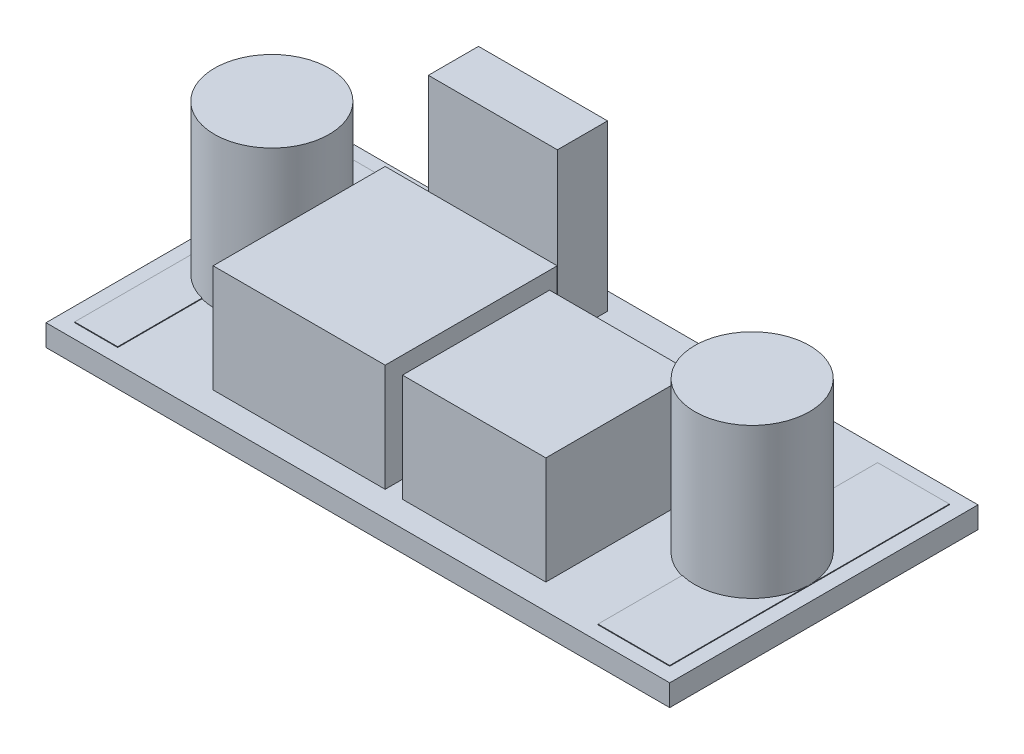
ISO-10303-21;
HEADER;
FILE_DESCRIPTION(('STEP AP214'),'2;1');
FILE_NAME('part.step','',(''),(''),'','','');
FILE_SCHEMA(('AUTOMOTIVE_DESIGN { 1 0 10303 214 1 1 1 1 }'));
ENDSEC;
DATA;
#1=APPLICATION_CONTEXT('core data for automotive mechanical design processes');
#2=APPLICATION_PROTOCOL_DEFINITION('international standard','automotive_design',2000,#1);
#3=PRODUCT_CONTEXT('',#1,'mechanical');
#4=PRODUCT('Part','Part','',(#3));
#5=PRODUCT_RELATED_PRODUCT_CATEGORY('part','',(#4));
#6=PRODUCT_DEFINITION_FORMATION('','',#4);
#7=PRODUCT_DEFINITION_CONTEXT('part definition',#1,'design');
#8=PRODUCT_DEFINITION('design','',#6,#7);
#9=PRODUCT_DEFINITION_SHAPE('','',#8);
#10=(LENGTH_UNIT() NAMED_UNIT(*) SI_UNIT(.MILLI.,.METRE.));
#11=(NAMED_UNIT(*) PLANE_ANGLE_UNIT() SI_UNIT($,.RADIAN.));
#12=(NAMED_UNIT(*) SI_UNIT($,.STERADIAN.) SOLID_ANGLE_UNIT());
#13=UNCERTAINTY_MEASURE_WITH_UNIT(LENGTH_MEASURE(1.E-05),#10,'distance_accuracy_value','');
#14=(GEOMETRIC_REPRESENTATION_CONTEXT(3) GLOBAL_UNCERTAINTY_ASSIGNED_CONTEXT((#13)) GLOBAL_UNIT_ASSIGNED_CONTEXT((#10,
#11,#12)) REPRESENTATION_CONTEXT('',''));
#15=CARTESIAN_POINT('',(0.,0.,0.));
#16=DIRECTION('',(0.,0.,1.));
#17=DIRECTION('',(1.,0.,0.));
#18=AXIS2_PLACEMENT_3D('',#15,#16,#17);
#19=CARTESIAN_POINT('',(-38.5,12.,0.));
#20=DIRECTION('',(0.,-1.,0.));
#21=DIRECTION('',(0.,0.,-1.));
#22=AXIS2_PLACEMENT_3D('',#19,#20,#21);
#23=CYLINDRICAL_SURFACE('',#22,4.00000000000001);
#24=CARTESIAN_POINT('',(-38.5,12.,0.));
#25=DIRECTION('',(0.,1.,0.));
#26=DIRECTION('',(0.,0.,1.));
#27=AXIS2_PLACEMENT_3D('',#24,#25,#26);
#28=CIRCLE('',#27,4.00000000000001);
#29=CARTESIAN_POINT('',(-38.5,12.,4.00000000000001));
#30=VERTEX_POINT('',#29);
#31=EDGE_CURVE('E54',#30,#30,#28,.T.);
#32=ORIENTED_EDGE('',*,*,#31,.F.);
#33=EDGE_LOOP('',(#32));
#34=FACE_BOUND('',#33,.T.);
#35=CARTESIAN_POINT('',(-38.5,0.,0.));
#36=DIRECTION('',(0.,1.,0.));
#37=DIRECTION('',(0.,0.,1.));
#38=AXIS2_PLACEMENT_3D('',#35,#36,#37);
#39=CIRCLE('',#38,4.00000000000001);
#40=CARTESIAN_POINT('',(-38.5,0.,4.00000000000001));
#41=VERTEX_POINT('',#40);
#42=EDGE_CURVE('E11',#41,#41,#39,.T.);
#43=ORIENTED_EDGE('',*,*,#42,.T.);
#44=EDGE_LOOP('',(#43));
#45=FACE_BOUND('',#44,.T.);
#46=ADVANCED_FACE('F50',(#34,#45),#23,.T.);
#47=CARTESIAN_POINT('',(-38.5,12.,0.));
#48=DIRECTION('',(0.,1.,0.));
#49=DIRECTION('',(0.,0.,1.));
#50=AXIS2_PLACEMENT_3D('',#47,#48,#49);
#51=PLANE('',#50);
#52=ORIENTED_EDGE('',*,*,#31,.T.);
#53=EDGE_LOOP('',(#52));
#54=FACE_BOUND('',#53,.T.);
#55=ADVANCED_FACE('F52',(#54),#51,.T.);
#56=CARTESIAN_POINT('',(-38.5,0.,0.));
#57=DIRECTION('',(0.,1.,0.));
#58=DIRECTION('',(0.,0.,1.));
#59=AXIS2_PLACEMENT_3D('',#56,#57,#58);
#60=PLANE('',#59);
#61=ORIENTED_EDGE('',*,*,#42,.F.);
#62=EDGE_LOOP('',(#61));
#63=FACE_BOUND('',#62,.T.);
#64=ADVANCED_FACE('F69',(#63),#60,.F.);
#65=CLOSED_SHELL('',(#46,#55,#64));
#66=MANIFOLD_SOLID_BREP('B2',#65);
#67=CARTESIAN_POINT('',(-5.,12.,0.));
#68=DIRECTION('',(0.,-1.,0.));
#69=DIRECTION('',(0.,0.,-1.));
#70=AXIS2_PLACEMENT_3D('',#67,#68,#69);
#71=CYLINDRICAL_SURFACE('',#70,4.);
#72=CARTESIAN_POINT('',(-5.,12.,0.));
#73=DIRECTION('',(0.,1.,0.));
#74=DIRECTION('',(0.,0.,1.));
#75=AXIS2_PLACEMENT_3D('',#72,#73,#74);
#76=CIRCLE('',#75,4.);
#77=CARTESIAN_POINT('',(-5.,12.,4.));
#78=VERTEX_POINT('',#77);
#79=EDGE_CURVE('E49',#78,#78,#76,.T.);
#80=ORIENTED_EDGE('',*,*,#79,.F.);
#81=EDGE_LOOP('',(#80));
#82=FACE_BOUND('',#81,.T.);
#83=CARTESIAN_POINT('',(-5.,0.,0.));
#84=DIRECTION('',(0.,1.,0.));
#85=DIRECTION('',(0.,0.,1.));
#86=AXIS2_PLACEMENT_3D('',#83,#84,#85);
#87=CIRCLE('',#86,4.);
#88=CARTESIAN_POINT('',(-5.,0.,4.));
#89=VERTEX_POINT('',#88);
#90=EDGE_CURVE('E110',#89,#89,#87,.T.);
#91=ORIENTED_EDGE('',*,*,#90,.T.);
#92=EDGE_LOOP('',(#91));
#93=FACE_BOUND('',#92,.T.);
#94=ADVANCED_FACE('F107',(#82,#93),#71,.T.);
#95=CARTESIAN_POINT('',(-5.,12.,0.));
#96=DIRECTION('',(0.,1.,0.));
#97=DIRECTION('',(0.,0.,1.));
#98=AXIS2_PLACEMENT_3D('',#95,#96,#97);
#99=PLANE('',#98);
#100=ORIENTED_EDGE('',*,*,#79,.T.);
#101=EDGE_LOOP('',(#100));
#102=FACE_BOUND('',#101,.T.);
#103=ADVANCED_FACE('F122',(#102),#99,.T.);
#104=CARTESIAN_POINT('',(-5.,0.,0.));
#105=DIRECTION('',(0.,1.,0.));
#106=DIRECTION('',(0.,0.,1.));
#107=AXIS2_PLACEMENT_3D('',#104,#105,#106);
#108=PLANE('',#107);
#109=ORIENTED_EDGE('',*,*,#90,.F.);
#110=EDGE_LOOP('',(#109));
#111=FACE_BOUND('',#110,.T.);
#112=ADVANCED_FACE('F120',(#111),#108,.F.);
#113=CLOSED_SHELL('',(#94,#103,#112));
#114=MANIFOLD_SOLID_BREP('B6',#113);
#115=CARTESIAN_POINT('',(-33.6103335027134,13.,-9.52267330220085));
#116=DIRECTION('',(1.,0.,0.));
#117=DIRECTION('',(0.,0.,-1.));
#118=AXIS2_PLACEMENT_3D('',#115,#116,#117);
#119=PLANE('',#118);
#120=DIRECTION('',(0.,0.,1.));
#121=VECTOR('',#120,1.);
#122=CARTESIAN_POINT('',(-33.6103335027134,0.,-9.52267330220085));
#123=LINE('',#122,#121);
#124=CARTESIAN_POINT('',(-33.6103335027134,0.,-9.52267330220085));
#125=VERTEX_POINT('',#124);
#126=CARTESIAN_POINT('',(-33.6103335027134,0.,-6.02729204304006));
#127=VERTEX_POINT('',#126);
#128=EDGE_CURVE('E221',#125,#127,#123,.T.);
#129=ORIENTED_EDGE('',*,*,#128,.T.);
#130=DIRECTION('',(0.,-1.,0.));
#131=VECTOR('',#130,1.);
#132=CARTESIAN_POINT('',(-33.6103335027134,13.,-6.02729204304006));
#133=LINE('',#132,#131);
#134=CARTESIAN_POINT('',(-33.6103335027134,13.,-6.02729204304006));
#135=VERTEX_POINT('',#134);
#136=EDGE_CURVE('E105',#135,#127,#133,.T.);
#137=ORIENTED_EDGE('',*,*,#136,.F.);
#138=DIRECTION('',(0.,0.,1.));
#139=VECTOR('',#138,1.);
#140=CARTESIAN_POINT('',(-33.6103335027134,13.,-9.52267330220085));
#141=LINE('',#140,#139);
#142=CARTESIAN_POINT('',(-33.6103335027134,13.,-9.52267330220085));
#143=VERTEX_POINT('',#142);
#144=EDGE_CURVE('E207',#143,#135,#141,.T.);
#145=ORIENTED_EDGE('',*,*,#144,.F.);
#146=DIRECTION('',(0.,-1.,0.));
#147=VECTOR('',#146,1.);
#148=CARTESIAN_POINT('',(-33.6103335027134,13.,-9.52267330220085));
#149=LINE('',#148,#147);
#150=EDGE_CURVE('E174',#143,#125,#149,.T.);
#151=ORIENTED_EDGE('',*,*,#150,.T.);
#152=EDGE_LOOP('',(#129,#137,#145,#151));
#153=FACE_BOUND('',#152,.T.);
#154=ADVANCED_FACE('F158',(#153),#119,.F.);
#155=CARTESIAN_POINT('',(-33.6103335027134,13.,-6.02729204304006));
#156=DIRECTION('',(0.,0.,-1.));
#157=DIRECTION('',(-1.,0.,0.));
#158=AXIS2_PLACEMENT_3D('',#155,#156,#157);
#159=PLANE('',#158);
#160=DIRECTION('',(1.,0.,0.));
#161=VECTOR('',#160,1.);
#162=CARTESIAN_POINT('',(-33.6103335027134,0.,-6.02729204304006));
#163=LINE('',#162,#161);
#164=CARTESIAN_POINT('',(-24.6103335027134,0.,-6.02729204304006));
#165=VERTEX_POINT('',#164);
#166=EDGE_CURVE('E212',#127,#165,#163,.T.);
#167=ORIENTED_EDGE('',*,*,#166,.T.);
#168=DIRECTION('',(0.,-1.,0.));
#169=VECTOR('',#168,1.);
#170=CARTESIAN_POINT('',(-24.6103335027134,13.,-6.02729204304006));
#171=LINE('',#170,#169);
#172=CARTESIAN_POINT('',(-24.6103335027134,13.,-6.02729204304006));
#173=VERTEX_POINT('',#172);
#174=EDGE_CURVE('E166',#173,#165,#171,.T.);
#175=ORIENTED_EDGE('',*,*,#174,.F.);
#176=DIRECTION('',(1.,0.,0.));
#177=VECTOR('',#176,1.);
#178=CARTESIAN_POINT('',(-33.6103335027134,13.,-6.02729204304006));
#179=LINE('',#178,#177);
#180=EDGE_CURVE('E199',#135,#173,#179,.T.);
#181=ORIENTED_EDGE('',*,*,#180,.F.);
#182=ORIENTED_EDGE('',*,*,#136,.T.);
#183=EDGE_LOOP('',(#167,#175,#181,#182));
#184=FACE_BOUND('',#183,.T.);
#185=ADVANCED_FACE('F211',(#184),#159,.F.);
#186=CARTESIAN_POINT('',(-24.6103335027134,13.,-9.52267330220085));
#187=DIRECTION('',(1.,0.,0.));
#188=DIRECTION('',(0.,0.,-1.));
#189=AXIS2_PLACEMENT_3D('',#186,#187,#188);
#190=PLANE('',#189);
#191=DIRECTION('',(0.,0.,1.));
#192=VECTOR('',#191,1.);
#193=CARTESIAN_POINT('',(-24.6103335027134,0.,-9.52267330220085));
#194=LINE('',#193,#192);
#195=CARTESIAN_POINT('',(-24.6103335027134,0.,-9.52267330220085));
#196=VERTEX_POINT('',#195);
#197=EDGE_CURVE('E224',#196,#165,#194,.T.);
#198=ORIENTED_EDGE('',*,*,#197,.F.);
#199=DIRECTION('',(0.,-1.,0.));
#200=VECTOR('',#199,1.);
#201=CARTESIAN_POINT('',(-24.6103335027134,13.,-9.52267330220085));
#202=LINE('',#201,#200);
#203=CARTESIAN_POINT('',(-24.6103335027134,13.,-9.52267330220085));
#204=VERTEX_POINT('',#203);
#205=EDGE_CURVE('E188',#204,#196,#202,.T.);
#206=ORIENTED_EDGE('',*,*,#205,.F.);
#207=DIRECTION('',(0.,0.,1.));
#208=VECTOR('',#207,1.);
#209=CARTESIAN_POINT('',(-24.6103335027134,13.,-9.52267330220085));
#210=LINE('',#209,#208);
#211=EDGE_CURVE('E206',#204,#173,#210,.T.);
#212=ORIENTED_EDGE('',*,*,#211,.T.);
#213=ORIENTED_EDGE('',*,*,#174,.T.);
#214=EDGE_LOOP('',(#198,#206,#212,#213));
#215=FACE_BOUND('',#214,.T.);
#216=ADVANCED_FACE('F215',(#215),#190,.T.);
#217=CARTESIAN_POINT('',(-33.6103335027134,13.,-9.52267330220085));
#218=DIRECTION('',(0.,0.,-1.));
#219=DIRECTION('',(-1.,0.,0.));
#220=AXIS2_PLACEMENT_3D('',#217,#218,#219);
#221=PLANE('',#220);
#222=DIRECTION('',(1.,0.,0.));
#223=VECTOR('',#222,1.);
#224=CARTESIAN_POINT('',(-33.6103335027134,0.,-9.52267330220085));
#225=LINE('',#224,#223);
#226=EDGE_CURVE('E226',#125,#196,#225,.T.);
#227=ORIENTED_EDGE('',*,*,#226,.F.);
#228=ORIENTED_EDGE('',*,*,#150,.F.);
#229=DIRECTION('',(1.,0.,0.));
#230=VECTOR('',#229,1.);
#231=CARTESIAN_POINT('',(-33.6103335027134,13.,-9.52267330220085));
#232=LINE('',#231,#230);
#233=EDGE_CURVE('E216',#143,#204,#232,.T.);
#234=ORIENTED_EDGE('',*,*,#233,.T.);
#235=ORIENTED_EDGE('',*,*,#205,.T.);
#236=EDGE_LOOP('',(#227,#228,#234,#235));
#237=FACE_BOUND('',#236,.T.);
#238=ADVANCED_FACE('F232',(#237),#221,.T.);
#239=CARTESIAN_POINT('',(0.,13.,0.));
#240=DIRECTION('',(0.,1.,0.));
#241=DIRECTION('',(0.,0.,1.));
#242=AXIS2_PLACEMENT_3D('',#239,#240,#241);
#243=PLANE('',#242);
#244=ORIENTED_EDGE('',*,*,#144,.T.);
#245=ORIENTED_EDGE('',*,*,#180,.T.);
#246=ORIENTED_EDGE('',*,*,#211,.F.);
#247=ORIENTED_EDGE('',*,*,#233,.F.);
#248=EDGE_LOOP('',(#244,#245,#246,#247));
#249=FACE_BOUND('',#248,.T.);
#250=ADVANCED_FACE('F203',(#249),#243,.T.);
#251=CARTESIAN_POINT('',(0.,0.,0.));
#252=DIRECTION('',(0.,1.,0.));
#253=DIRECTION('',(0.,0.,1.));
#254=AXIS2_PLACEMENT_3D('',#251,#252,#253);
#255=PLANE('',#254);
#256=ORIENTED_EDGE('',*,*,#128,.F.);
#257=ORIENTED_EDGE('',*,*,#226,.T.);
#258=ORIENTED_EDGE('',*,*,#197,.T.);
#259=ORIENTED_EDGE('',*,*,#166,.F.);
#260=EDGE_LOOP('',(#256,#257,#258,#259));
#261=FACE_BOUND('',#260,.T.);
#262=ADVANCED_FACE('F231',(#261),#255,.F.);
#263=CLOSED_SHELL('',(#154,#185,#216,#238,#250,#262));
#264=MANIFOLD_SOLID_BREP('B44',#263);
#265=CARTESIAN_POINT('',(0.,1.5,0.));
#266=DIRECTION('',(0.,-1.,0.));
#267=DIRECTION('',(0.,0.,-1.));
#268=AXIS2_PLACEMENT_3D('',#265,#266,#267);
#269=PLANE('',#268);
#270=DIRECTION('',(0.,0.,1.));
#271=VECTOR('',#270,1.);
#272=CARTESIAN_POINT('',(-33.6103335027134,1.5,0.));
#273=LINE('',#272,#271);
#274=CARTESIAN_POINT('',(-33.6103335027134,1.5,-3.01507766074693));
#275=VERTEX_POINT('',#274);
#276=CARTESIAN_POINT('',(-33.6103335027134,1.5,8.98492233925307));
#277=VERTEX_POINT('',#276);
#278=EDGE_CURVE('E482',#275,#277,#273,.T.);
#279=ORIENTED_EDGE('',*,*,#278,.F.);
#280=DIRECTION('',(1.,0.,0.));
#281=VECTOR('',#280,1.);
#282=CARTESIAN_POINT('',(0.,1.5,-3.01507766074693));
#283=LINE('',#282,#281);
#284=CARTESIAN_POINT('',(-21.6103335027134,1.5,-3.01507766074693));
#285=VERTEX_POINT('',#284);
#286=EDGE_CURVE('E474',#275,#285,#283,.T.);
#287=ORIENTED_EDGE('',*,*,#286,.T.);
#288=DIRECTION('',(0.,0.,1.));
#289=VECTOR('',#288,1.);
#290=CARTESIAN_POINT('',(-21.6103335027134,1.5,0.));
#291=LINE('',#290,#289);
#292=CARTESIAN_POINT('',(-21.6103335027134,1.5,8.98492233925307));
#293=VERTEX_POINT('',#292);
#294=EDGE_CURVE('E477',#285,#293,#291,.T.);
#295=ORIENTED_EDGE('',*,*,#294,.T.);
#296=DIRECTION('',(1.,0.,0.));
#297=VECTOR('',#296,1.);
#298=CARTESIAN_POINT('',(0.,1.5,8.98492233925307));
#299=LINE('',#298,#297);
#300=EDGE_CURVE('E480',#277,#293,#299,.T.);
#301=ORIENTED_EDGE('',*,*,#300,.F.);
#302=EDGE_LOOP('',(#279,#287,#295,#301));
#303=FACE_BOUND('',#302,.T.);
#304=DIRECTION('',(1.,0.,0.));
#305=VECTOR('',#304,1.);
#306=CARTESIAN_POINT('',(0.,1.5,9.75000000000001));
#307=LINE('',#306,#305);
#308=CARTESIAN_POINT('',(-6.,1.5,9.75000000000001));
#309=VERTEX_POINT('',#308);
#310=CARTESIAN_POINT('',(-0.999999999999997,1.5,9.75000000000001));
#311=VERTEX_POINT('',#310);
#312=EDGE_CURVE('E553',#309,#311,#307,.T.);
#313=ORIENTED_EDGE('',*,*,#312,.F.);
#314=DIRECTION('',(0.,0.,1.));
#315=VECTOR('',#314,1.);
#316=CARTESIAN_POINT('',(-6.,1.5,0.));
#317=LINE('',#316,#315);
#318=CARTESIAN_POINT('',(-6.,1.5,-9.75));
#319=VERTEX_POINT('',#318);
#320=EDGE_CURVE('E550',#319,#309,#317,.T.);
#321=ORIENTED_EDGE('',*,*,#320,.F.);
#322=DIRECTION('',(-1.,0.,0.));
#323=VECTOR('',#322,1.);
#324=CARTESIAN_POINT('',(0.,1.5,-9.75));
#325=LINE('',#324,#323);
#326=CARTESIAN_POINT('',(-1.,1.5,-9.75));
#327=VERTEX_POINT('',#326);
#328=EDGE_CURVE('E547',#327,#319,#325,.T.);
#329=ORIENTED_EDGE('',*,*,#328,.F.);
#330=DIRECTION('',(0.,0.,-1.));
#331=VECTOR('',#330,1.);
#332=CARTESIAN_POINT('',(-0.999999999999999,1.5,0.));
#333=LINE('',#332,#331);
#334=EDGE_CURVE('E531',#311,#327,#333,.T.);
#335=ORIENTED_EDGE('',*,*,#334,.F.);
#336=EDGE_LOOP('',(#313,#321,#329,#335));
#337=FACE_BOUND('',#336,.T.);
#338=DIRECTION('',(0.,0.,-1.));
#339=VECTOR('',#338,1.);
#340=CARTESIAN_POINT('',(0.,1.5,-10.75));
#341=LINE('',#340,#339);
#342=CARTESIAN_POINT('',(0.,1.5,10.75));
#343=VERTEX_POINT('',#342);
#344=CARTESIAN_POINT('',(0.,1.5,-10.75));
#345=VERTEX_POINT('',#344);
#346=EDGE_CURVE('E557',#343,#345,#341,.T.);
#347=ORIENTED_EDGE('',*,*,#346,.T.);
#348=DIRECTION('',(-1.,0.,0.));
#349=VECTOR('',#348,1.);
#350=CARTESIAN_POINT('',(0.,1.5,-10.75));
#351=LINE('',#350,#349);
#352=CARTESIAN_POINT('',(-43.5,1.5,-10.75));
#353=VERTEX_POINT('',#352);
#354=EDGE_CURVE('E560',#345,#353,#351,.T.);
#355=ORIENTED_EDGE('',*,*,#354,.T.);
#356=DIRECTION('',(0.,0.,1.));
#357=VECTOR('',#356,1.);
#358=CARTESIAN_POINT('',(-43.5,1.5,-10.75));
#359=LINE('',#358,#357);
#360=CARTESIAN_POINT('',(-43.5,1.5,10.75));
#361=VERTEX_POINT('',#360);
#362=EDGE_CURVE('E563',#353,#361,#359,.T.);
#363=ORIENTED_EDGE('',*,*,#362,.T.);
#364=DIRECTION('',(1.,0.,0.));
#365=VECTOR('',#364,1.);
#366=CARTESIAN_POINT('',(0.,1.5,10.75));
#367=LINE('',#366,#365);
#368=EDGE_CURVE('E565',#361,#343,#367,.T.);
#369=ORIENTED_EDGE('',*,*,#368,.T.);
#370=EDGE_LOOP('',(#347,#355,#363,#369));
#371=FACE_BOUND('',#370,.T.);
#372=DIRECTION('',(-1.,0.,0.));
#373=VECTOR('',#372,1.);
#374=CARTESIAN_POINT('',(0.,1.5,-9.74999999999999));
#375=LINE('',#374,#373);
#376=CARTESIAN_POINT('',(-39.5,1.5,-9.74999999999999));
#377=VERTEX_POINT('',#376);
#378=CARTESIAN_POINT('',(-42.5,1.5,-9.74999999999999));
#379=VERTEX_POINT('',#378);
#380=EDGE_CURVE('E517',#377,#379,#375,.T.);
#381=ORIENTED_EDGE('',*,*,#380,.F.);
#382=DIRECTION('',(0.,0.,-1.));
#383=VECTOR('',#382,1.);
#384=CARTESIAN_POINT('',(-39.5,1.5,0.));
#385=LINE('',#384,#383);
#386=CARTESIAN_POINT('',(-39.5,1.5,9.75000000000001));
#387=VERTEX_POINT('',#386);
#388=EDGE_CURVE('E514',#387,#377,#385,.T.);
#389=ORIENTED_EDGE('',*,*,#388,.F.);
#390=DIRECTION('',(1.,0.,0.));
#391=VECTOR('',#390,1.);
#392=CARTESIAN_POINT('',(0.,1.5,9.74999999999998));
#393=LINE('',#392,#391);
#394=CARTESIAN_POINT('',(-42.5,1.5,9.75000000000001));
#395=VERTEX_POINT('',#394);
#396=EDGE_CURVE('E511',#395,#387,#393,.T.);
#397=ORIENTED_EDGE('',*,*,#396,.F.);
#398=DIRECTION('',(0.,0.,1.));
#399=VECTOR('',#398,1.);
#400=CARTESIAN_POINT('',(-42.5,1.5,0.));
#401=LINE('',#400,#399);
#402=EDGE_CURVE('E495',#379,#395,#401,.T.);
#403=ORIENTED_EDGE('',*,*,#402,.F.);
#404=EDGE_LOOP('',(#381,#389,#397,#403));
#405=FACE_BOUND('',#404,.T.);
#406=DIRECTION('',(0.,0.,1.));
#407=VECTOR('',#406,1.);
#408=CARTESIAN_POINT('',(-20.4056225926305,1.5,0.));
#409=LINE('',#408,#407);
#410=CARTESIAN_POINT('',(-20.4056225926305,1.5,-1.27715853700104));
#411=VERTEX_POINT('',#410);
#412=CARTESIAN_POINT('',(-20.4056225926305,1.5,8.98492233925307));
#413=VERTEX_POINT('',#412);
#414=EDGE_CURVE('E452',#411,#413,#409,.T.);
#415=ORIENTED_EDGE('',*,*,#414,.F.);
#416=DIRECTION('',(1.,0.,0.));
#417=VECTOR('',#416,1.);
#418=CARTESIAN_POINT('',(0.,1.5,-1.27715853700104));
#419=LINE('',#418,#417);
#420=CARTESIAN_POINT('',(-10.4056225926305,1.5,-1.27715853700104));
#421=VERTEX_POINT('',#420);
#422=EDGE_CURVE('E424',#411,#421,#419,.T.);
#423=ORIENTED_EDGE('',*,*,#422,.T.);
#424=DIRECTION('',(0.,0.,1.));
#425=VECTOR('',#424,1.);
#426=CARTESIAN_POINT('',(-10.4056225926305,1.5,0.));
#427=LINE('',#426,#425);
#428=CARTESIAN_POINT('',(-10.4056225926305,1.5,8.98492233925307));
#429=VERTEX_POINT('',#428);
#430=EDGE_CURVE('E447',#421,#429,#427,.T.);
#431=ORIENTED_EDGE('',*,*,#430,.T.);
#432=DIRECTION('',(1.,0.,0.));
#433=VECTOR('',#432,1.);
#434=CARTESIAN_POINT('',(0.,1.5,8.98492233925307));
#435=LINE('',#434,#433);
#436=EDGE_CURVE('E450',#413,#429,#435,.T.);
#437=ORIENTED_EDGE('',*,*,#436,.F.);
#438=EDGE_LOOP('',(#415,#423,#431,#437));
#439=FACE_BOUND('',#438,.T.);
#440=ADVANCED_FACE('F283',(#303,#337,#371,#405,#439),#269,.F.);
#441=CARTESIAN_POINT('',(0.,1.5,-10.75));
#442=DIRECTION('',(-1.,0.,0.));
#443=DIRECTION('',(0.,0.,1.));
#444=AXIS2_PLACEMENT_3D('',#441,#442,#443);
#445=PLANE('',#444);
#446=DIRECTION('',(0.,0.,-1.));
#447=VECTOR('',#446,1.);
#448=CARTESIAN_POINT('',(0.,0.,-10.75));
#449=LINE('',#448,#447);
#450=CARTESIAN_POINT('',(0.,0.,10.75));
#451=VERTEX_POINT('',#450);
#452=CARTESIAN_POINT('',(0.,0.,-10.75));
#453=VERTEX_POINT('',#452);
#454=EDGE_CURVE('E556',#451,#453,#449,.T.);
#455=ORIENTED_EDGE('',*,*,#454,.T.);
#456=DIRECTION('',(0.,-1.,0.));
#457=VECTOR('',#456,1.);
#458=CARTESIAN_POINT('',(0.,1.5,-10.75));
#459=LINE('',#458,#457);
#460=EDGE_CURVE('E156',#345,#453,#459,.T.);
#461=ORIENTED_EDGE('',*,*,#460,.F.);
#462=ORIENTED_EDGE('',*,*,#346,.F.);
#463=DIRECTION('',(0.,-1.,0.));
#464=VECTOR('',#463,1.);
#465=CARTESIAN_POINT('',(0.,1.5,10.75));
#466=LINE('',#465,#464);
#467=EDGE_CURVE('E567',#343,#451,#466,.T.);
#468=ORIENTED_EDGE('',*,*,#467,.T.);
#469=EDGE_LOOP('',(#455,#461,#462,#468));
#470=FACE_BOUND('',#469,.T.);
#471=ADVANCED_FACE('F285',(#470),#445,.F.);
#472=CARTESIAN_POINT('',(0.,1.5,-10.75));
#473=DIRECTION('',(0.,0.,1.));
#474=DIRECTION('',(1.,0.,0.));
#475=AXIS2_PLACEMENT_3D('',#472,#473,#474);
#476=PLANE('',#475);
#477=DIRECTION('',(-1.,0.,0.));
#478=VECTOR('',#477,1.);
#479=CARTESIAN_POINT('',(0.,0.,-10.75));
#480=LINE('',#479,#478);
#481=CARTESIAN_POINT('',(-43.5,0.,-10.75));
#482=VERTEX_POINT('',#481);
#483=EDGE_CURVE('E570',#453,#482,#480,.T.);
#484=ORIENTED_EDGE('',*,*,#483,.T.);
#485=DIRECTION('',(0.,-1.,0.));
#486=VECTOR('',#485,1.);
#487=CARTESIAN_POINT('',(-43.5,1.5,-10.75));
#488=LINE('',#487,#486);
#489=EDGE_CURVE('E291',#353,#482,#488,.T.);
#490=ORIENTED_EDGE('',*,*,#489,.F.);
#491=ORIENTED_EDGE('',*,*,#354,.F.);
#492=ORIENTED_EDGE('',*,*,#460,.T.);
#493=EDGE_LOOP('',(#484,#490,#491,#492));
#494=FACE_BOUND('',#493,.T.);
#495=ADVANCED_FACE('F600',(#494),#476,.F.);
#496=CARTESIAN_POINT('',(-43.5,1.5,-10.75));
#497=DIRECTION('',(1.,0.,0.));
#498=DIRECTION('',(0.,0.,-1.));
#499=AXIS2_PLACEMENT_3D('',#496,#497,#498);
#500=PLANE('',#499);
#501=DIRECTION('',(0.,0.,1.));
#502=VECTOR('',#501,1.);
#503=CARTESIAN_POINT('',(-43.5,0.,-10.75));
#504=LINE('',#503,#502);
#505=CARTESIAN_POINT('',(-43.5,0.,10.75));
#506=VERTEX_POINT('',#505);
#507=EDGE_CURVE('E572',#482,#506,#504,.T.);
#508=ORIENTED_EDGE('',*,*,#507,.T.);
#509=DIRECTION('',(0.,-1.,0.));
#510=VECTOR('',#509,1.);
#511=CARTESIAN_POINT('',(-43.5,1.5,10.75));
#512=LINE('',#511,#510);
#513=EDGE_CURVE('E577',#361,#506,#512,.T.);
#514=ORIENTED_EDGE('',*,*,#513,.F.);
#515=ORIENTED_EDGE('',*,*,#362,.F.);
#516=ORIENTED_EDGE('',*,*,#489,.T.);
#517=EDGE_LOOP('',(#508,#514,#515,#516));
#518=FACE_BOUND('',#517,.T.);
#519=ADVANCED_FACE('F584',(#518),#500,.F.);
#520=CARTESIAN_POINT('',(0.,1.5,10.75));
#521=DIRECTION('',(0.,0.,-1.));
#522=DIRECTION('',(-1.,0.,0.));
#523=AXIS2_PLACEMENT_3D('',#520,#521,#522);
#524=PLANE('',#523);
#525=DIRECTION('',(1.,0.,0.));
#526=VECTOR('',#525,1.);
#527=CARTESIAN_POINT('',(0.,0.,10.75));
#528=LINE('',#527,#526);
#529=EDGE_CURVE('E561',#506,#451,#528,.T.);
#530=ORIENTED_EDGE('',*,*,#529,.T.);
#531=ORIENTED_EDGE('',*,*,#467,.F.);
#532=ORIENTED_EDGE('',*,*,#368,.F.);
#533=ORIENTED_EDGE('',*,*,#513,.T.);
#534=EDGE_LOOP('',(#530,#531,#532,#533));
#535=FACE_BOUND('',#534,.T.);
#536=ADVANCED_FACE('F593',(#535),#524,.F.);
#537=CARTESIAN_POINT('',(0.,0.,0.));
#538=DIRECTION('',(0.,-1.,0.));
#539=DIRECTION('',(0.,0.,-1.));
#540=AXIS2_PLACEMENT_3D('',#537,#538,#539);
#541=PLANE('',#540);
#542=ORIENTED_EDGE('',*,*,#454,.F.);
#543=ORIENTED_EDGE('',*,*,#529,.F.);
#544=ORIENTED_EDGE('',*,*,#507,.F.);
#545=ORIENTED_EDGE('',*,*,#483,.F.);
#546=EDGE_LOOP('',(#542,#543,#544,#545));
#547=FACE_BOUND('',#546,.T.);
#548=ADVANCED_FACE('F590',(#547),#541,.T.);
#549=CARTESIAN_POINT('',(-0.999999999999997,21.7308221391974,9.75000000000001));
#550=DIRECTION('',(0.,0.,-1.));
#551=DIRECTION('',(-1.,0.,0.));
#552=AXIS2_PLACEMENT_3D('',#549,#550,#551);
#553=PLANE('',#552);
#554=DIRECTION('',(0.,-1.,0.));
#555=VECTOR('',#554,1.);
#556=CARTESIAN_POINT('',(-6.,21.7308221391974,9.75000000000001));
#557=LINE('',#556,#555);
#558=CARTESIAN_POINT('',(-6.,1.55,9.75000000000001));
#559=VERTEX_POINT('',#558);
#560=EDGE_CURVE('E534',#559,#309,#557,.T.);
#561=ORIENTED_EDGE('',*,*,#560,.T.);
#562=ORIENTED_EDGE('',*,*,#312,.T.);
#563=DIRECTION('',(0.,-1.,0.));
#564=VECTOR('',#563,1.);
#565=CARTESIAN_POINT('',(-0.999999999999997,21.7308221391974,9.75000000000001));
#566=LINE('',#565,#564);
#567=CARTESIAN_POINT('',(-0.999999999999997,1.55,9.75000000000001));
#568=VERTEX_POINT('',#567);
#569=EDGE_CURVE('E520',#568,#311,#566,.T.);
#570=ORIENTED_EDGE('',*,*,#569,.F.);
#571=DIRECTION('',(-1.,0.,0.));
#572=VECTOR('',#571,1.);
#573=CARTESIAN_POINT('',(-0.999999999999997,1.55,9.75000000000001));
#574=LINE('',#573,#572);
#575=EDGE_CURVE('E525',#568,#559,#574,.T.);
#576=ORIENTED_EDGE('',*,*,#575,.T.);
#577=EDGE_LOOP('',(#561,#562,#570,#576));
#578=FACE_BOUND('',#577,.T.);
#579=ADVANCED_FACE('F620',(#578),#553,.F.);
#580=CARTESIAN_POINT('',(-6.,21.7308221391974,-9.75));
#581=DIRECTION('',(1.,0.,0.));
#582=DIRECTION('',(0.,0.,-1.));
#583=AXIS2_PLACEMENT_3D('',#580,#581,#582);
#584=PLANE('',#583);
#585=DIRECTION('',(0.,-1.,0.));
#586=VECTOR('',#585,1.);
#587=CARTESIAN_POINT('',(-6.,21.7308221391974,-9.75));
#588=LINE('',#587,#586);
#589=CARTESIAN_POINT('',(-6.,1.55,-9.75));
#590=VERTEX_POINT('',#589);
#591=EDGE_CURVE('E537',#590,#319,#588,.T.);
#592=ORIENTED_EDGE('',*,*,#591,.T.);
#593=ORIENTED_EDGE('',*,*,#320,.T.);
#594=ORIENTED_EDGE('',*,*,#560,.F.);
#595=DIRECTION('',(0.,0.,-1.));
#596=VECTOR('',#595,1.);
#597=CARTESIAN_POINT('',(-6.,1.55,-9.75));
#598=LINE('',#597,#596);
#599=EDGE_CURVE('E521',#559,#590,#598,.T.);
#600=ORIENTED_EDGE('',*,*,#599,.T.);
#601=EDGE_LOOP('',(#592,#593,#594,#600));
#602=FACE_BOUND('',#601,.T.);
#603=ADVANCED_FACE('F637',(#602),#584,.F.);
#604=CARTESIAN_POINT('',(-1.,21.7308221391974,-9.75));
#605=DIRECTION('',(0.,0.,1.));
#606=DIRECTION('',(1.,0.,0.));
#607=AXIS2_PLACEMENT_3D('',#604,#605,#606);
#608=PLANE('',#607);
#609=DIRECTION('',(0.,-1.,0.));
#610=VECTOR('',#609,1.);
#611=CARTESIAN_POINT('',(-1.,21.7308221391974,-9.75));
#612=LINE('',#611,#610);
#613=CARTESIAN_POINT('',(-1.,1.55,-9.75));
#614=VERTEX_POINT('',#613);
#615=EDGE_CURVE('E540',#614,#327,#612,.T.);
#616=ORIENTED_EDGE('',*,*,#615,.T.);
#617=ORIENTED_EDGE('',*,*,#328,.T.);
#618=ORIENTED_EDGE('',*,*,#591,.F.);
#619=DIRECTION('',(1.,0.,0.));
#620=VECTOR('',#619,1.);
#621=CARTESIAN_POINT('',(-1.,1.55,-9.75));
#622=LINE('',#621,#620);
#623=EDGE_CURVE('E524',#590,#614,#622,.T.);
#624=ORIENTED_EDGE('',*,*,#623,.T.);
#625=EDGE_LOOP('',(#616,#617,#618,#624));
#626=FACE_BOUND('',#625,.T.);
#627=ADVANCED_FACE('F645',(#626),#608,.F.);
#628=CARTESIAN_POINT('',(-1.,21.7308221391974,-9.75));
#629=DIRECTION('',(-1.,0.,0.));
#630=DIRECTION('',(0.,0.,1.));
#631=AXIS2_PLACEMENT_3D('',#628,#629,#630);
#632=PLANE('',#631);
#633=ORIENTED_EDGE('',*,*,#569,.T.);
#634=ORIENTED_EDGE('',*,*,#334,.T.);
#635=ORIENTED_EDGE('',*,*,#615,.F.);
#636=DIRECTION('',(0.,0.,1.));
#637=VECTOR('',#636,1.);
#638=CARTESIAN_POINT('',(-1.,1.55,-9.75));
#639=LINE('',#638,#637);
#640=EDGE_CURVE('E528',#614,#568,#639,.T.);
#641=ORIENTED_EDGE('',*,*,#640,.T.);
#642=EDGE_LOOP('',(#633,#634,#635,#641));
#643=FACE_BOUND('',#642,.T.);
#644=ADVANCED_FACE('F616',(#643),#632,.F.);
#645=CARTESIAN_POINT('',(0.,1.55,0.));
#646=DIRECTION('',(0.,-1.,0.));
#647=DIRECTION('',(0.,0.,-1.));
#648=AXIS2_PLACEMENT_3D('',#645,#646,#647);
#649=PLANE('',#648);
#650=ORIENTED_EDGE('',*,*,#623,.F.);
#651=ORIENTED_EDGE('',*,*,#599,.F.);
#652=ORIENTED_EDGE('',*,*,#575,.F.);
#653=ORIENTED_EDGE('',*,*,#640,.F.);
#654=EDGE_LOOP('',(#650,#651,#652,#653));
#655=FACE_BOUND('',#654,.T.);
#656=ADVANCED_FACE('F659',(#655),#649,.F.);
#657=CARTESIAN_POINT('',(-42.5,21.7308221391974,-9.74999999999999));
#658=DIRECTION('',(0.,0.,1.));
#659=DIRECTION('',(1.,0.,0.));
#660=AXIS2_PLACEMENT_3D('',#657,#658,#659);
#661=PLANE('',#660);
#662=DIRECTION('',(0.,-1.,0.));
#663=VECTOR('',#662,1.);
#664=CARTESIAN_POINT('',(-39.5,21.7308221391974,-9.74999999999999));
#665=LINE('',#664,#663);
#666=CARTESIAN_POINT('',(-39.5,1.55,-9.74999999999999));
#667=VERTEX_POINT('',#666);
#668=EDGE_CURVE('E498',#667,#377,#665,.T.);
#669=ORIENTED_EDGE('',*,*,#668,.T.);
#670=ORIENTED_EDGE('',*,*,#380,.T.);
#671=DIRECTION('',(0.,-1.,0.));
#672=VECTOR('',#671,1.);
#673=CARTESIAN_POINT('',(-42.5,21.7308221391974,-9.74999999999999));
#674=LINE('',#673,#672);
#675=CARTESIAN_POINT('',(-42.5,1.55,-9.74999999999999));
#676=VERTEX_POINT('',#675);
#677=EDGE_CURVE('E484',#676,#379,#674,.T.);
#678=ORIENTED_EDGE('',*,*,#677,.F.);
#679=DIRECTION('',(1.,0.,0.));
#680=VECTOR('',#679,1.);
#681=CARTESIAN_POINT('',(-42.5,1.55,-9.74999999999999));
#682=LINE('',#681,#680);
#683=EDGE_CURVE('E489',#676,#667,#682,.T.);
#684=ORIENTED_EDGE('',*,*,#683,.T.);
#685=EDGE_LOOP('',(#669,#670,#678,#684));
#686=FACE_BOUND('',#685,.T.);
#687=ADVANCED_FACE('F667',(#686),#661,.F.);
#688=CARTESIAN_POINT('',(-39.5,21.7308221391974,-9.74999999999999));
#689=DIRECTION('',(-1.,0.,0.));
#690=DIRECTION('',(0.,0.,1.));
#691=AXIS2_PLACEMENT_3D('',#688,#689,#690);
#692=PLANE('',#691);
#693=DIRECTION('',(0.,-1.,0.));
#694=VECTOR('',#693,1.);
#695=CARTESIAN_POINT('',(-39.5,21.7308221391974,9.75000000000001));
#696=LINE('',#695,#694);
#697=CARTESIAN_POINT('',(-39.5,1.55,9.75));
#698=VERTEX_POINT('',#697);
#699=EDGE_CURVE('E501',#698,#387,#696,.T.);
#700=ORIENTED_EDGE('',*,*,#699,.T.);
#701=ORIENTED_EDGE('',*,*,#388,.T.);
#702=ORIENTED_EDGE('',*,*,#668,.F.);
#703=DIRECTION('',(0.,0.,1.));
#704=VECTOR('',#703,1.);
#705=CARTESIAN_POINT('',(-39.5,1.55,-9.74999999999999));
#706=LINE('',#705,#704);
#707=EDGE_CURVE('E485',#667,#698,#706,.T.);
#708=ORIENTED_EDGE('',*,*,#707,.T.);
#709=EDGE_LOOP('',(#700,#701,#702,#708));
#710=FACE_BOUND('',#709,.T.);
#711=ADVANCED_FACE('F676',(#710),#692,.F.);
#712=CARTESIAN_POINT('',(-42.5,21.7308221391974,9.75000000000001));
#713=DIRECTION('',(0.,0.,-1.));
#714=DIRECTION('',(-1.,0.,0.));
#715=AXIS2_PLACEMENT_3D('',#712,#713,#714);
#716=PLANE('',#715);
#717=DIRECTION('',(0.,-1.,0.));
#718=VECTOR('',#717,1.);
#719=CARTESIAN_POINT('',(-42.5,21.7308221391974,9.75000000000001));
#720=LINE('',#719,#718);
#721=CARTESIAN_POINT('',(-42.5,1.55,9.75000000000001));
#722=VERTEX_POINT('',#721);
#723=EDGE_CURVE('E504',#722,#395,#720,.T.);
#724=ORIENTED_EDGE('',*,*,#723,.T.);
#725=ORIENTED_EDGE('',*,*,#396,.T.);
#726=ORIENTED_EDGE('',*,*,#699,.F.);
#727=DIRECTION('',(-1.,0.,0.));
#728=VECTOR('',#727,1.);
#729=CARTESIAN_POINT('',(-42.5,1.55,9.75000000000001));
#730=LINE('',#729,#728);
#731=EDGE_CURVE('E488',#698,#722,#730,.T.);
#732=ORIENTED_EDGE('',*,*,#731,.T.);
#733=EDGE_LOOP('',(#724,#725,#726,#732));
#734=FACE_BOUND('',#733,.T.);
#735=ADVANCED_FACE('F684',(#734),#716,.F.);
#736=CARTESIAN_POINT('',(-42.5,21.7308221391974,-9.74999999999999));
#737=DIRECTION('',(1.,0.,0.));
#738=DIRECTION('',(0.,0.,-1.));
#739=AXIS2_PLACEMENT_3D('',#736,#737,#738);
#740=PLANE('',#739);
#741=ORIENTED_EDGE('',*,*,#677,.T.);
#742=ORIENTED_EDGE('',*,*,#402,.T.);
#743=ORIENTED_EDGE('',*,*,#723,.F.);
#744=DIRECTION('',(0.,0.,-1.));
#745=VECTOR('',#744,1.);
#746=CARTESIAN_POINT('',(-42.5,1.55,-9.74999999999999));
#747=LINE('',#746,#745);
#748=EDGE_CURVE('E492',#722,#676,#747,.T.);
#749=ORIENTED_EDGE('',*,*,#748,.T.);
#750=EDGE_LOOP('',(#741,#742,#743,#749));
#751=FACE_BOUND('',#750,.T.);
#752=ADVANCED_FACE('F692',(#751),#740,.F.);
#753=CARTESIAN_POINT('',(0.,1.55,0.));
#754=DIRECTION('',(0.,-1.,0.));
#755=DIRECTION('',(0.,0.,-1.));
#756=AXIS2_PLACEMENT_3D('',#753,#754,#755);
#757=PLANE('',#756);
#758=ORIENTED_EDGE('',*,*,#731,.F.);
#759=ORIENTED_EDGE('',*,*,#707,.F.);
#760=ORIENTED_EDGE('',*,*,#683,.F.);
#761=ORIENTED_EDGE('',*,*,#748,.F.);
#762=EDGE_LOOP('',(#758,#759,#760,#761));
#763=FACE_BOUND('',#762,.T.);
#764=ADVANCED_FACE('F700',(#763),#757,.F.);
#765=CARTESIAN_POINT('',(-33.6103335027134,9.,-3.01507766074693));
#766=DIRECTION('',(1.,0.,0.));
#767=DIRECTION('',(0.,0.,-1.));
#768=AXIS2_PLACEMENT_3D('',#765,#766,#767);
#769=PLANE('',#768);
#770=DIRECTION('',(0.,-1.,0.));
#771=VECTOR('',#770,1.);
#772=CARTESIAN_POINT('',(-33.6103335027134,9.,-3.01507766074693));
#773=LINE('',#772,#771);
#774=CARTESIAN_POINT('',(-33.6103335027134,9.,-3.01507766074693));
#775=VERTEX_POINT('',#774);
#776=EDGE_CURVE('E464',#775,#275,#773,.T.);
#777=ORIENTED_EDGE('',*,*,#776,.T.);
#778=ORIENTED_EDGE('',*,*,#278,.T.);
#779=DIRECTION('',(0.,-1.,0.));
#780=VECTOR('',#779,1.);
#781=CARTESIAN_POINT('',(-33.6103335027134,9.,8.98492233925307));
#782=LINE('',#781,#780);
#783=CARTESIAN_POINT('',(-33.6103335027134,9.,8.98492233925307));
#784=VERTEX_POINT('',#783);
#785=EDGE_CURVE('E471',#784,#277,#782,.T.);
#786=ORIENTED_EDGE('',*,*,#785,.F.);
#787=DIRECTION('',(0.,0.,1.));
#788=VECTOR('',#787,1.);
#789=CARTESIAN_POINT('',(-33.6103335027134,9.,-3.01507766074693));
#790=LINE('',#789,#788);
#791=EDGE_CURVE('E454',#775,#784,#790,.T.);
#792=ORIENTED_EDGE('',*,*,#791,.F.);
#793=EDGE_LOOP('',(#777,#778,#786,#792));
#794=FACE_BOUND('',#793,.T.);
#795=ADVANCED_FACE('F708',(#794),#769,.F.);
#796=CARTESIAN_POINT('',(-33.6103335027134,9.,8.98492233925307));
#797=DIRECTION('',(0.,0.,-1.));
#798=DIRECTION('',(-1.,0.,0.));
#799=AXIS2_PLACEMENT_3D('',#796,#797,#798);
#800=PLANE('',#799);
#801=ORIENTED_EDGE('',*,*,#785,.T.);
#802=ORIENTED_EDGE('',*,*,#300,.T.);
#803=DIRECTION('',(0.,-1.,0.));
#804=VECTOR('',#803,1.);
#805=CARTESIAN_POINT('',(-21.6103335027134,9.,8.98492233925307));
#806=LINE('',#805,#804);
#807=CARTESIAN_POINT('',(-21.6103335027134,9.,8.98492233925307));
#808=VERTEX_POINT('',#807);
#809=EDGE_CURVE('E468',#808,#293,#806,.T.);
#810=ORIENTED_EDGE('',*,*,#809,.F.);
#811=DIRECTION('',(1.,0.,0.));
#812=VECTOR('',#811,1.);
#813=CARTESIAN_POINT('',(-33.6103335027134,9.,8.98492233925307));
#814=LINE('',#813,#812);
#815=EDGE_CURVE('E457',#784,#808,#814,.T.);
#816=ORIENTED_EDGE('',*,*,#815,.F.);
#817=EDGE_LOOP('',(#801,#802,#810,#816));
#818=FACE_BOUND('',#817,.T.);
#819=ADVANCED_FACE('F715',(#818),#800,.F.);
#820=CARTESIAN_POINT('',(-21.6103335027134,9.,-3.01507766074693));
#821=DIRECTION('',(1.,0.,0.));
#822=DIRECTION('',(0.,0.,-1.));
#823=AXIS2_PLACEMENT_3D('',#820,#821,#822);
#824=PLANE('',#823);
#825=ORIENTED_EDGE('',*,*,#294,.F.);
#826=DIRECTION('',(0.,-1.,0.));
#827=VECTOR('',#826,1.);
#828=CARTESIAN_POINT('',(-21.6103335027134,9.,-3.01507766074693));
#829=LINE('',#828,#827);
#830=CARTESIAN_POINT('',(-21.6103335027134,9.,-3.01507766074693));
#831=VERTEX_POINT('',#830);
#832=EDGE_CURVE('E306',#831,#285,#829,.T.);
#833=ORIENTED_EDGE('',*,*,#832,.F.);
#834=DIRECTION('',(0.,0.,1.));
#835=VECTOR('',#834,1.);
#836=CARTESIAN_POINT('',(-21.6103335027134,9.,-3.01507766074693));
#837=LINE('',#836,#835);
#838=EDGE_CURVE('E459',#831,#808,#837,.T.);
#839=ORIENTED_EDGE('',*,*,#838,.T.);
#840=ORIENTED_EDGE('',*,*,#809,.T.);
#841=EDGE_LOOP('',(#825,#833,#839,#840));
#842=FACE_BOUND('',#841,.T.);
#843=ADVANCED_FACE('F723',(#842),#824,.T.);
#844=CARTESIAN_POINT('',(-33.6103335027134,9.,-3.01507766074693));
#845=DIRECTION('',(0.,0.,-1.));
#846=DIRECTION('',(-1.,0.,0.));
#847=AXIS2_PLACEMENT_3D('',#844,#845,#846);
#848=PLANE('',#847);
#849=ORIENTED_EDGE('',*,*,#286,.F.);
#850=ORIENTED_EDGE('',*,*,#776,.F.);
#851=DIRECTION('',(1.,0.,0.));
#852=VECTOR('',#851,1.);
#853=CARTESIAN_POINT('',(-33.6103335027134,9.,-3.01507766074693));
#854=LINE('',#853,#852);
#855=EDGE_CURVE('E462',#775,#831,#854,.T.);
#856=ORIENTED_EDGE('',*,*,#855,.T.);
#857=ORIENTED_EDGE('',*,*,#832,.T.);
#858=EDGE_LOOP('',(#849,#850,#856,#857));
#859=FACE_BOUND('',#858,.T.);
#860=ADVANCED_FACE('F731',(#859),#848,.T.);
#861=CARTESIAN_POINT('',(0.,9.,0.));
#862=DIRECTION('',(0.,1.,0.));
#863=DIRECTION('',(0.,0.,1.));
#864=AXIS2_PLACEMENT_3D('',#861,#862,#863);
#865=PLANE('',#864);
#866=ORIENTED_EDGE('',*,*,#791,.T.);
#867=ORIENTED_EDGE('',*,*,#815,.T.);
#868=ORIENTED_EDGE('',*,*,#838,.F.);
#869=ORIENTED_EDGE('',*,*,#855,.F.);
#870=EDGE_LOOP('',(#866,#867,#868,#869));
#871=FACE_BOUND('',#870,.T.);
#872=ADVANCED_FACE('F739',(#871),#865,.T.);
#873=CARTESIAN_POINT('',(-20.4056225926305,9.,-1.27715853700104));
#874=DIRECTION('',(1.,0.,0.));
#875=DIRECTION('',(0.,0.,-1.));
#876=AXIS2_PLACEMENT_3D('',#873,#874,#875);
#877=PLANE('',#876);
#878=DIRECTION('',(0.,-1.,0.));
#879=VECTOR('',#878,1.);
#880=CARTESIAN_POINT('',(-20.4056225926305,9.,-1.27715853700104));
#881=LINE('',#880,#879);
#882=CARTESIAN_POINT('',(-20.4056225926305,9.,-1.27715853700104));
#883=VERTEX_POINT('',#882);
#884=EDGE_CURVE('E418',#883,#411,#881,.T.);
#885=ORIENTED_EDGE('',*,*,#884,.T.);
#886=ORIENTED_EDGE('',*,*,#414,.T.);
#887=DIRECTION('',(0.,-1.,0.));
#888=VECTOR('',#887,1.);
#889=CARTESIAN_POINT('',(-20.4056225926305,9.,8.98492233925307));
#890=LINE('',#889,#888);
#891=CARTESIAN_POINT('',(-20.4056225926305,9.,8.98492233925307));
#892=VERTEX_POINT('',#891);
#893=EDGE_CURVE('E433',#892,#413,#890,.T.);
#894=ORIENTED_EDGE('',*,*,#893,.F.);
#895=DIRECTION('',(0.,0.,1.));
#896=VECTOR('',#895,1.);
#897=CARTESIAN_POINT('',(-20.4056225926305,9.,-1.27715853700104));
#898=LINE('',#897,#896);
#899=EDGE_CURVE('E430',#883,#892,#898,.T.);
#900=ORIENTED_EDGE('',*,*,#899,.F.);
#901=EDGE_LOOP('',(#885,#886,#894,#900));
#902=FACE_BOUND('',#901,.T.);
#903=ADVANCED_FACE('F431',(#902),#877,.F.);
#904=CARTESIAN_POINT('',(-20.4056225926305,9.,8.98492233925307));
#905=DIRECTION('',(0.,0.,-1.));
#906=DIRECTION('',(-1.,0.,0.));
#907=AXIS2_PLACEMENT_3D('',#904,#905,#906);
#908=PLANE('',#907);
#909=ORIENTED_EDGE('',*,*,#893,.T.);
#910=ORIENTED_EDGE('',*,*,#436,.T.);
#911=DIRECTION('',(0.,-1.,0.));
#912=VECTOR('',#911,1.);
#913=CARTESIAN_POINT('',(-10.4056225926305,9.,8.98492233925307));
#914=LINE('',#913,#912);
#915=CARTESIAN_POINT('',(-10.4056225926305,9.,8.98492233925307));
#916=VERTEX_POINT('',#915);
#917=EDGE_CURVE('E852',#916,#429,#914,.T.);
#918=ORIENTED_EDGE('',*,*,#917,.F.);
#919=DIRECTION('',(1.,0.,0.));
#920=VECTOR('',#919,1.);
#921=CARTESIAN_POINT('',(-20.4056225926305,9.,8.98492233925307));
#922=LINE('',#921,#920);
#923=EDGE_CURVE('E435',#892,#916,#922,.T.);
#924=ORIENTED_EDGE('',*,*,#923,.F.);
#925=EDGE_LOOP('',(#909,#910,#918,#924));
#926=FACE_BOUND('',#925,.T.);
#927=ADVANCED_FACE('F753',(#926),#908,.F.);
#928=CARTESIAN_POINT('',(-10.4056225926305,9.,-1.27715853700104));
#929=DIRECTION('',(1.,0.,0.));
#930=DIRECTION('',(0.,0.,-1.));
#931=AXIS2_PLACEMENT_3D('',#928,#929,#930);
#932=PLANE('',#931);
#933=ORIENTED_EDGE('',*,*,#430,.F.);
#934=DIRECTION('',(0.,-1.,0.));
#935=VECTOR('',#934,1.);
#936=CARTESIAN_POINT('',(-10.4056225926305,9.,-1.27715853700104));
#937=LINE('',#936,#935);
#938=CARTESIAN_POINT('',(-10.4056225926305,9.,-1.27715853700104));
#939=VERTEX_POINT('',#938);
#940=EDGE_CURVE('E298',#939,#421,#937,.T.);
#941=ORIENTED_EDGE('',*,*,#940,.F.);
#942=DIRECTION('',(0.,0.,1.));
#943=VECTOR('',#942,1.);
#944=CARTESIAN_POINT('',(-10.4056225926305,9.,-1.27715853700104));
#945=LINE('',#944,#943);
#946=EDGE_CURVE('E440',#939,#916,#945,.T.);
#947=ORIENTED_EDGE('',*,*,#946,.T.);
#948=ORIENTED_EDGE('',*,*,#917,.T.);
#949=EDGE_LOOP('',(#933,#941,#947,#948));
#950=FACE_BOUND('',#949,.T.);
#951=ADVANCED_FACE('F760',(#950),#932,.T.);
#952=CARTESIAN_POINT('',(-20.4056225926305,9.,-1.27715853700104));
#953=DIRECTION('',(0.,0.,-1.));
#954=DIRECTION('',(-1.,0.,0.));
#955=AXIS2_PLACEMENT_3D('',#952,#953,#954);
#956=PLANE('',#955);
#957=ORIENTED_EDGE('',*,*,#422,.F.);
#958=ORIENTED_EDGE('',*,*,#884,.F.);
#959=DIRECTION('',(1.,0.,0.));
#960=VECTOR('',#959,1.);
#961=CARTESIAN_POINT('',(-20.4056225926305,9.,-1.27715853700104));
#962=LINE('',#961,#960);
#963=EDGE_CURVE('E422',#883,#939,#962,.T.);
#964=ORIENTED_EDGE('',*,*,#963,.T.);
#965=ORIENTED_EDGE('',*,*,#940,.T.);
#966=EDGE_LOOP('',(#957,#958,#964,#965));
#967=FACE_BOUND('',#966,.T.);
#968=ADVANCED_FACE('F420',(#967),#956,.T.);
#969=CARTESIAN_POINT('',(0.,9.,0.));
#970=DIRECTION('',(0.,1.,0.));
#971=DIRECTION('',(0.,0.,1.));
#972=AXIS2_PLACEMENT_3D('',#969,#970,#971);
#973=PLANE('',#972);
#974=ORIENTED_EDGE('',*,*,#899,.T.);
#975=ORIENTED_EDGE('',*,*,#923,.T.);
#976=ORIENTED_EDGE('',*,*,#946,.F.);
#977=ORIENTED_EDGE('',*,*,#963,.F.);
#978=EDGE_LOOP('',(#974,#975,#976,#977));
#979=FACE_BOUND('',#978,.T.);
#980=ADVANCED_FACE('F438',(#979),#973,.T.);
#981=CLOSED_SHELL('',(#440,#471,#495,#519,#536,#548,#579,#603,#627,#644,#656,#687,#711,#735,
#752,#764,#795,#819,#843,#860,#872,#903,#927,#951,#968,#980));
#982=MANIFOLD_SOLID_BREP('B99',#981);
#983=ADVANCED_BREP_SHAPE_REPRESENTATION('',(#18,#66,#114,#264,#982),#14);
#984=SHAPE_DEFINITION_REPRESENTATION(#9,#983);
ENDSEC;
END-ISO-10303-21;
